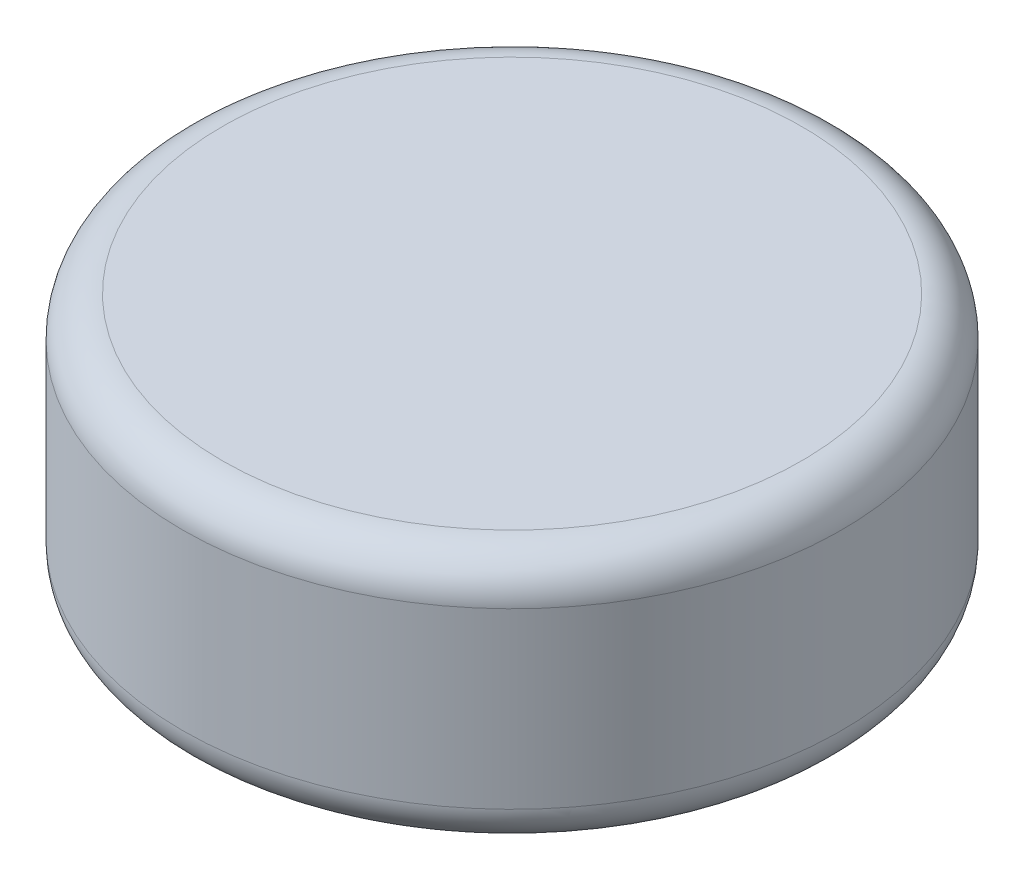
ISO-10303-21;
HEADER;
FILE_DESCRIPTION(('STEP AP214'),'2;1');
FILE_NAME('part.step','',(''),(''),'','','');
FILE_SCHEMA(('AUTOMOTIVE_DESIGN { 1 0 10303 214 1 1 1 1 }'));
ENDSEC;
DATA;
#1=APPLICATION_CONTEXT('core data for automotive mechanical design processes');
#2=APPLICATION_PROTOCOL_DEFINITION('international standard','automotive_design',2000,#1);
#3=PRODUCT_CONTEXT('',#1,'mechanical');
#4=PRODUCT('Part','Part','',(#3));
#5=PRODUCT_RELATED_PRODUCT_CATEGORY('part','',(#4));
#6=PRODUCT_DEFINITION_FORMATION('','',#4);
#7=PRODUCT_DEFINITION_CONTEXT('part definition',#1,'design');
#8=PRODUCT_DEFINITION('design','',#6,#7);
#9=PRODUCT_DEFINITION_SHAPE('','',#8);
#10=(LENGTH_UNIT() NAMED_UNIT(*) SI_UNIT(.MILLI.,.METRE.));
#11=(NAMED_UNIT(*) PLANE_ANGLE_UNIT() SI_UNIT($,.RADIAN.));
#12=(NAMED_UNIT(*) SI_UNIT($,.STERADIAN.) SOLID_ANGLE_UNIT());
#13=UNCERTAINTY_MEASURE_WITH_UNIT(LENGTH_MEASURE(1.E-05),#10,'distance_accuracy_value','');
#14=(GEOMETRIC_REPRESENTATION_CONTEXT(3) GLOBAL_UNCERTAINTY_ASSIGNED_CONTEXT((#13)) GLOBAL_UNIT_ASSIGNED_CONTEXT((#10,
#11,#12)) REPRESENTATION_CONTEXT('',''));
#15=CARTESIAN_POINT('',(0.,0.,0.));
#16=DIRECTION('',(0.,0.,1.));
#17=DIRECTION('',(1.,0.,0.));
#18=AXIS2_PLACEMENT_3D('',#15,#16,#17);
#19=CARTESIAN_POINT('',(0.,254.,0.));
#20=DIRECTION('',(0.,-1.,0.));
#21=DIRECTION('',(0.,0.,-1.));
#22=AXIS2_PLACEMENT_3D('',#19,#20,#21);
#23=CYLINDRICAL_SURFACE('',#22,330.2);
#24=CARTESIAN_POINT('',(0.,40.,0.));
#25=DIRECTION('',(0.,1.,0.));
#26=DIRECTION('',(0.,0.,1.));
#27=AXIS2_PLACEMENT_3D('',#24,#25,#26);
#28=CIRCLE('',#27,330.2);
#29=CARTESIAN_POINT('',(0.,40.,330.2));
#30=VERTEX_POINT('',#29);
#31=EDGE_CURVE('E58',#30,#30,#28,.T.);
#32=ORIENTED_EDGE('',*,*,#31,.T.);
#33=EDGE_LOOP('',(#32));
#34=FACE_BOUND('',#33,.T.);
#35=CARTESIAN_POINT('',(0.,214.,0.));
#36=DIRECTION('',(0.,1.,0.));
#37=DIRECTION('',(0.,0.,1.));
#38=AXIS2_PLACEMENT_3D('',#35,#36,#37);
#39=CIRCLE('',#38,330.2);
#40=CARTESIAN_POINT('',(0.,214.,330.2));
#41=VERTEX_POINT('',#40);
#42=EDGE_CURVE('E63',#41,#41,#39,.F.);
#43=ORIENTED_EDGE('',*,*,#42,.T.);
#44=EDGE_LOOP('',(#43));
#45=FACE_BOUND('',#44,.T.);
#46=ADVANCED_FACE('F45',(#34,#45),#23,.T.);
#47=CARTESIAN_POINT('',(0.,254.,0.));
#48=DIRECTION('',(0.,1.,0.));
#49=DIRECTION('',(0.,0.,1.));
#50=AXIS2_PLACEMENT_3D('',#47,#48,#49);
#51=PLANE('',#50);
#52=CARTESIAN_POINT('',(0.,254.,0.));
#53=DIRECTION('',(0.,1.,0.));
#54=DIRECTION('',(0.,0.,1.));
#55=AXIS2_PLACEMENT_3D('',#52,#53,#54);
#56=CIRCLE('',#55,290.2);
#57=CARTESIAN_POINT('',(0.,254.,290.2));
#58=VERTEX_POINT('',#57);
#59=EDGE_CURVE('E10',#58,#58,#56,.T.);
#60=ORIENTED_EDGE('',*,*,#59,.T.);
#61=EDGE_LOOP('',(#60));
#62=FACE_BOUND('',#61,.T.);
#63=ADVANCED_FACE('F80',(#62),#51,.T.);
#64=CARTESIAN_POINT('',(0.,0.,0.));
#65=DIRECTION('',(0.,1.,0.));
#66=DIRECTION('',(0.,0.,1.));
#67=AXIS2_PLACEMENT_3D('',#64,#65,#66);
#68=PLANE('',#67);
#69=CARTESIAN_POINT('',(0.,0.,0.));
#70=DIRECTION('',(0.,1.,0.));
#71=DIRECTION('',(0.,0.,1.));
#72=AXIS2_PLACEMENT_3D('',#69,#70,#71);
#73=CIRCLE('',#72,290.2);
#74=CARTESIAN_POINT('',(0.,0.,290.2));
#75=VERTEX_POINT('',#74);
#76=EDGE_CURVE('E53',#75,#75,#73,.F.);
#77=ORIENTED_EDGE('',*,*,#76,.T.);
#78=EDGE_LOOP('',(#77));
#79=FACE_BOUND('',#78,.T.);
#80=ADVANCED_FACE('F77',(#79),#68,.F.);
#81=CARTESIAN_POINT('',(0.,40.,0.));
#82=DIRECTION('',(0.,1.,0.));
#83=DIRECTION('',(0.,0.,1.));
#84=AXIS2_PLACEMENT_3D('',#81,#82,#83);
#85=TOROIDAL_SURFACE('',#84,290.2,40.);
#86=ORIENTED_EDGE('',*,*,#76,.F.);
#87=EDGE_LOOP('',(#86));
#88=FACE_BOUND('',#87,.T.);
#89=ORIENTED_EDGE('',*,*,#31,.F.);
#90=EDGE_LOOP('',(#89));
#91=FACE_BOUND('',#90,.T.);
#92=ADVANCED_FACE('F73',(#88,#91),#85,.T.);
#93=CARTESIAN_POINT('',(0.,214.,0.));
#94=DIRECTION('',(0.,1.,0.));
#95=DIRECTION('',(0.,0.,1.));
#96=AXIS2_PLACEMENT_3D('',#93,#94,#95);
#97=TOROIDAL_SURFACE('',#96,290.2,40.);
#98=ORIENTED_EDGE('',*,*,#42,.F.);
#99=EDGE_LOOP('',(#98));
#100=FACE_BOUND('',#99,.T.);
#101=ORIENTED_EDGE('',*,*,#59,.F.);
#102=EDGE_LOOP('',(#101));
#103=FACE_BOUND('',#102,.T.);
#104=ADVANCED_FACE('F47',(#100,#103),#97,.T.);
#105=CLOSED_SHELL('',(#46,#63,#80,#92,#104));
#106=MANIFOLD_SOLID_BREP('B2',#105);
#107=ADVANCED_BREP_SHAPE_REPRESENTATION('',(#18,#106),#14);
#108=SHAPE_DEFINITION_REPRESENTATION(#9,#107);
ENDSEC;
END-ISO-10303-21;
